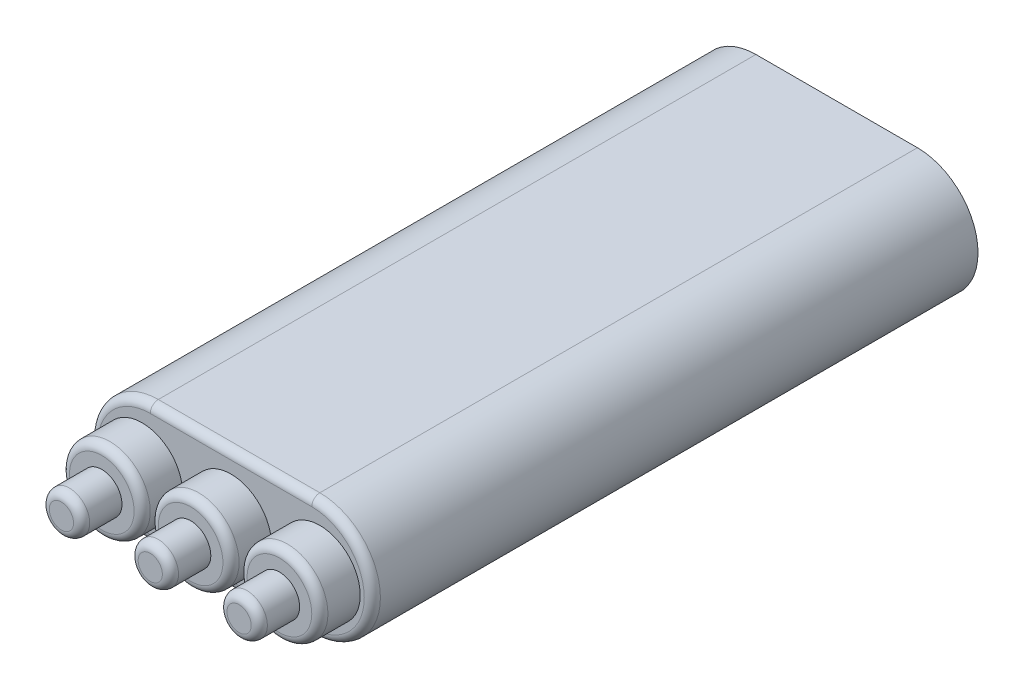
ISO-10303-21;
HEADER;
FILE_DESCRIPTION(('STEP AP214'),'2;1');
FILE_NAME('part.step','',(''),(''),'','','');
FILE_SCHEMA(('AUTOMOTIVE_DESIGN { 1 0 10303 214 1 1 1 1 }'));
ENDSEC;
DATA;
#1=APPLICATION_CONTEXT('core data for automotive mechanical design processes');
#2=APPLICATION_PROTOCOL_DEFINITION('international standard','automotive_design',2000,#1);
#3=PRODUCT_CONTEXT('',#1,'mechanical');
#4=PRODUCT('Part','Part','',(#3));
#5=PRODUCT_RELATED_PRODUCT_CATEGORY('part','',(#4));
#6=PRODUCT_DEFINITION_FORMATION('','',#4);
#7=PRODUCT_DEFINITION_CONTEXT('part definition',#1,'design');
#8=PRODUCT_DEFINITION('design','',#6,#7);
#9=PRODUCT_DEFINITION_SHAPE('','',#8);
#10=(LENGTH_UNIT() NAMED_UNIT(*) SI_UNIT(.MILLI.,.METRE.));
#11=(NAMED_UNIT(*) PLANE_ANGLE_UNIT() SI_UNIT($,.RADIAN.));
#12=(NAMED_UNIT(*) SI_UNIT($,.STERADIAN.) SOLID_ANGLE_UNIT());
#13=UNCERTAINTY_MEASURE_WITH_UNIT(LENGTH_MEASURE(1.E-05),#10,'distance_accuracy_value','');
#14=(GEOMETRIC_REPRESENTATION_CONTEXT(3) GLOBAL_UNCERTAINTY_ASSIGNED_CONTEXT((#13)) GLOBAL_UNIT_ASSIGNED_CONTEXT((#10,
#11,#12)) REPRESENTATION_CONTEXT('',''));
#15=CARTESIAN_POINT('',(0.,0.,0.));
#16=DIRECTION('',(0.,0.,1.));
#17=DIRECTION('',(1.,0.,0.));
#18=AXIS2_PLACEMENT_3D('',#15,#16,#17);
#19=CARTESIAN_POINT('',(2.2,0.,17.));
#20=DIRECTION('',(0.,0.,-1.));
#21=DIRECTION('',(-1.,0.,0.));
#22=AXIS2_PLACEMENT_3D('',#19,#20,#21);
#23=CYLINDRICAL_SURFACE('',#22,0.5);
#24=CARTESIAN_POINT('',(2.2,0.,16.8));
#25=DIRECTION('',(0.,0.,1.));
#26=DIRECTION('',(1.,0.,0.));
#27=AXIS2_PLACEMENT_3D('',#24,#25,#26);
#28=CIRCLE('',#27,0.5);
#29=CARTESIAN_POINT('',(2.7,0.,16.8));
#30=VERTEX_POINT('',#29);
#31=EDGE_CURVE('E11',#30,#30,#28,.F.);
#32=ORIENTED_EDGE('',*,*,#31,.T.);
#33=EDGE_LOOP('',(#32));
#34=FACE_BOUND('',#33,.T.);
#35=CARTESIAN_POINT('',(2.2,0.,16.));
#36=DIRECTION('',(0.,0.,1.));
#37=DIRECTION('',(1.,0.,0.));
#38=AXIS2_PLACEMENT_3D('',#35,#36,#37);
#39=CIRCLE('',#38,0.5);
#40=CARTESIAN_POINT('',(2.7,0.,16.));
#41=VERTEX_POINT('',#40);
#42=EDGE_CURVE('E53',#41,#41,#39,.T.);
#43=ORIENTED_EDGE('',*,*,#42,.T.);
#44=EDGE_LOOP('',(#43));
#45=FACE_BOUND('',#44,.T.);
#46=ADVANCED_FACE('F42',(#34,#45),#23,.T.);
#47=CARTESIAN_POINT('',(2.2,0.,17.));
#48=DIRECTION('',(0.,0.,1.));
#49=DIRECTION('',(1.,0.,0.));
#50=AXIS2_PLACEMENT_3D('',#47,#48,#49);
#51=PLANE('',#50);
#52=CARTESIAN_POINT('',(2.2,0.,17.));
#53=DIRECTION('',(0.,0.,1.));
#54=DIRECTION('',(1.,0.,0.));
#55=AXIS2_PLACEMENT_3D('',#52,#53,#54);
#56=CIRCLE('',#55,0.3);
#57=CARTESIAN_POINT('',(2.5,0.,17.));
#58=VERTEX_POINT('',#57);
#59=EDGE_CURVE('E49',#58,#58,#56,.T.);
#60=ORIENTED_EDGE('',*,*,#59,.T.);
#61=EDGE_LOOP('',(#60));
#62=FACE_BOUND('',#61,.T.);
#63=ADVANCED_FACE('F63',(#62),#51,.T.);
#64=CARTESIAN_POINT('',(2.2,0.,16.));
#65=DIRECTION('',(0.,0.,1.));
#66=DIRECTION('',(1.,0.,0.));
#67=AXIS2_PLACEMENT_3D('',#64,#65,#66);
#68=PLANE('',#67);
#69=ORIENTED_EDGE('',*,*,#42,.F.);
#70=EDGE_LOOP('',(#69));
#71=FACE_BOUND('',#70,.T.);
#72=ADVANCED_FACE('F61',(#71),#68,.F.);
#73=CARTESIAN_POINT('',(2.2,0.,16.8));
#74=DIRECTION('',(0.,0.,1.));
#75=DIRECTION('',(1.,0.,0.));
#76=AXIS2_PLACEMENT_3D('',#73,#74,#75);
#77=TOROIDAL_SURFACE('',#76,0.3,0.2);
#78=ORIENTED_EDGE('',*,*,#31,.F.);
#79=EDGE_LOOP('',(#78));
#80=FACE_BOUND('',#79,.T.);
#81=ORIENTED_EDGE('',*,*,#59,.F.);
#82=EDGE_LOOP('',(#81));
#83=FACE_BOUND('',#82,.T.);
#84=ADVANCED_FACE('F44',(#80,#83),#77,.T.);
#85=CLOSED_SHELL('',(#46,#63,#72,#84));
#86=MANIFOLD_SOLID_BREP('B2',#85);
#87=CARTESIAN_POINT('',(-2.2,0.,17.));
#88=DIRECTION('',(0.,0.,-1.));
#89=DIRECTION('',(-1.,0.,0.));
#90=AXIS2_PLACEMENT_3D('',#87,#88,#89);
#91=CYLINDRICAL_SURFACE('',#90,0.5);
#92=CARTESIAN_POINT('',(-2.2,0.,16.8));
#93=DIRECTION('',(0.,0.,1.));
#94=DIRECTION('',(1.,0.,0.));
#95=AXIS2_PLACEMENT_3D('',#92,#93,#94);
#96=CIRCLE('',#95,0.5);
#97=CARTESIAN_POINT('',(-1.7,0.,16.8));
#98=VERTEX_POINT('',#97);
#99=EDGE_CURVE('E41',#98,#98,#96,.F.);
#100=ORIENTED_EDGE('',*,*,#99,.T.);
#101=EDGE_LOOP('',(#100));
#102=FACE_BOUND('',#101,.T.);
#103=CARTESIAN_POINT('',(-2.2,0.,16.));
#104=DIRECTION('',(0.,0.,1.));
#105=DIRECTION('',(1.,0.,0.));
#106=AXIS2_PLACEMENT_3D('',#103,#104,#105);
#107=CIRCLE('',#106,0.5);
#108=CARTESIAN_POINT('',(-1.7,0.,16.));
#109=VERTEX_POINT('',#108);
#110=EDGE_CURVE('E117',#109,#109,#107,.T.);
#111=ORIENTED_EDGE('',*,*,#110,.T.);
#112=EDGE_LOOP('',(#111));
#113=FACE_BOUND('',#112,.T.);
#114=ADVANCED_FACE('F106',(#102,#113),#91,.T.);
#115=CARTESIAN_POINT('',(-2.2,0.,17.));
#116=DIRECTION('',(0.,0.,1.));
#117=DIRECTION('',(1.,0.,0.));
#118=AXIS2_PLACEMENT_3D('',#115,#116,#117);
#119=PLANE('',#118);
#120=CARTESIAN_POINT('',(-2.2,0.,17.));
#121=DIRECTION('',(0.,0.,1.));
#122=DIRECTION('',(1.,0.,0.));
#123=AXIS2_PLACEMENT_3D('',#120,#121,#122);
#124=CIRCLE('',#123,0.3);
#125=CARTESIAN_POINT('',(-1.9,0.,17.));
#126=VERTEX_POINT('',#125);
#127=EDGE_CURVE('E113',#126,#126,#124,.T.);
#128=ORIENTED_EDGE('',*,*,#127,.T.);
#129=EDGE_LOOP('',(#128));
#130=FACE_BOUND('',#129,.T.);
#131=ADVANCED_FACE('F127',(#130),#119,.T.);
#132=CARTESIAN_POINT('',(-2.2,0.,16.));
#133=DIRECTION('',(0.,0.,1.));
#134=DIRECTION('',(1.,0.,0.));
#135=AXIS2_PLACEMENT_3D('',#132,#133,#134);
#136=PLANE('',#135);
#137=ORIENTED_EDGE('',*,*,#110,.F.);
#138=EDGE_LOOP('',(#137));
#139=FACE_BOUND('',#138,.T.);
#140=ADVANCED_FACE('F125',(#139),#136,.F.);
#141=CARTESIAN_POINT('',(-2.2,0.,16.8));
#142=DIRECTION('',(0.,0.,1.));
#143=DIRECTION('',(1.,0.,0.));
#144=AXIS2_PLACEMENT_3D('',#141,#142,#143);
#145=TOROIDAL_SURFACE('',#144,0.3,0.2);
#146=ORIENTED_EDGE('',*,*,#99,.F.);
#147=EDGE_LOOP('',(#146));
#148=FACE_BOUND('',#147,.T.);
#149=ORIENTED_EDGE('',*,*,#127,.F.);
#150=EDGE_LOOP('',(#149));
#151=FACE_BOUND('',#150,.T.);
#152=ADVANCED_FACE('F108',(#148,#151),#145,.T.);
#153=CLOSED_SHELL('',(#114,#131,#140,#152));
#154=MANIFOLD_SOLID_BREP('B6',#153);
#155=CARTESIAN_POINT('',(0.,0.,17.));
#156=DIRECTION('',(0.,0.,-1.));
#157=DIRECTION('',(-1.,0.,0.));
#158=AXIS2_PLACEMENT_3D('',#155,#156,#157);
#159=CYLINDRICAL_SURFACE('',#158,0.5);
#160=CARTESIAN_POINT('',(0.,0.,16.8));
#161=DIRECTION('',(0.,0.,1.));
#162=DIRECTION('',(1.,0.,0.));
#163=AXIS2_PLACEMENT_3D('',#160,#161,#162);
#164=CIRCLE('',#163,0.5);
#165=CARTESIAN_POINT('',(0.5,0.,16.8));
#166=VERTEX_POINT('',#165);
#167=EDGE_CURVE('E105',#166,#166,#164,.F.);
#168=ORIENTED_EDGE('',*,*,#167,.T.);
#169=EDGE_LOOP('',(#168));
#170=FACE_BOUND('',#169,.T.);
#171=CARTESIAN_POINT('',(0.,0.,16.));
#172=DIRECTION('',(0.,0.,1.));
#173=DIRECTION('',(1.,0.,0.));
#174=AXIS2_PLACEMENT_3D('',#171,#172,#173);
#175=CIRCLE('',#174,0.5);
#176=CARTESIAN_POINT('',(0.5,0.,16.));
#177=VERTEX_POINT('',#176);
#178=EDGE_CURVE('E181',#177,#177,#175,.T.);
#179=ORIENTED_EDGE('',*,*,#178,.T.);
#180=EDGE_LOOP('',(#179));
#181=FACE_BOUND('',#180,.T.);
#182=ADVANCED_FACE('F170',(#170,#181),#159,.T.);
#183=CARTESIAN_POINT('',(0.,0.,17.));
#184=DIRECTION('',(0.,0.,1.));
#185=DIRECTION('',(1.,0.,0.));
#186=AXIS2_PLACEMENT_3D('',#183,#184,#185);
#187=PLANE('',#186);
#188=CARTESIAN_POINT('',(0.,0.,17.));
#189=DIRECTION('',(0.,0.,1.));
#190=DIRECTION('',(1.,0.,0.));
#191=AXIS2_PLACEMENT_3D('',#188,#189,#190);
#192=CIRCLE('',#191,0.3);
#193=CARTESIAN_POINT('',(0.3,0.,17.));
#194=VERTEX_POINT('',#193);
#195=EDGE_CURVE('E177',#194,#194,#192,.T.);
#196=ORIENTED_EDGE('',*,*,#195,.T.);
#197=EDGE_LOOP('',(#196));
#198=FACE_BOUND('',#197,.T.);
#199=ADVANCED_FACE('F191',(#198),#187,.T.);
#200=CARTESIAN_POINT('',(0.,0.,16.));
#201=DIRECTION('',(0.,0.,1.));
#202=DIRECTION('',(1.,0.,0.));
#203=AXIS2_PLACEMENT_3D('',#200,#201,#202);
#204=PLANE('',#203);
#205=ORIENTED_EDGE('',*,*,#178,.F.);
#206=EDGE_LOOP('',(#205));
#207=FACE_BOUND('',#206,.T.);
#208=ADVANCED_FACE('F189',(#207),#204,.F.);
#209=CARTESIAN_POINT('',(0.,0.,16.8));
#210=DIRECTION('',(0.,0.,1.));
#211=DIRECTION('',(1.,0.,0.));
#212=AXIS2_PLACEMENT_3D('',#209,#210,#211);
#213=TOROIDAL_SURFACE('',#212,0.3,0.2);
#214=ORIENTED_EDGE('',*,*,#167,.F.);
#215=EDGE_LOOP('',(#214));
#216=FACE_BOUND('',#215,.T.);
#217=ORIENTED_EDGE('',*,*,#195,.F.);
#218=EDGE_LOOP('',(#217));
#219=FACE_BOUND('',#218,.T.);
#220=ADVANCED_FACE('F172',(#216,#219),#213,.T.);
#221=CLOSED_SHELL('',(#182,#199,#208,#220));
#222=MANIFOLD_SOLID_BREP('B36',#221);
#223=CARTESIAN_POINT('',(2.2,0.,16.));
#224=DIRECTION('',(0.,0.,-1.));
#225=DIRECTION('',(-1.,0.,0.));
#226=AXIS2_PLACEMENT_3D('',#223,#224,#225);
#227=CYLINDRICAL_SURFACE('',#226,1.);
#228=CARTESIAN_POINT('',(2.2,0.,15.8));
#229=DIRECTION('',(0.,0.,1.));
#230=DIRECTION('',(1.,0.,0.));
#231=AXIS2_PLACEMENT_3D('',#228,#229,#230);
#232=CIRCLE('',#231,1.);
#233=CARTESIAN_POINT('',(3.2,0.,15.8));
#234=VERTEX_POINT('',#233);
#235=EDGE_CURVE('E169',#234,#234,#232,.F.);
#236=ORIENTED_EDGE('',*,*,#235,.T.);
#237=EDGE_LOOP('',(#236));
#238=FACE_BOUND('',#237,.T.);
#239=CARTESIAN_POINT('',(2.2,0.,15.));
#240=DIRECTION('',(0.,0.,1.));
#241=DIRECTION('',(1.,0.,0.));
#242=AXIS2_PLACEMENT_3D('',#239,#240,#241);
#243=CIRCLE('',#242,1.);
#244=CARTESIAN_POINT('',(3.2,0.,15.));
#245=VERTEX_POINT('',#244);
#246=EDGE_CURVE('E245',#245,#245,#243,.T.);
#247=ORIENTED_EDGE('',*,*,#246,.T.);
#248=EDGE_LOOP('',(#247));
#249=FACE_BOUND('',#248,.T.);
#250=ADVANCED_FACE('F234',(#238,#249),#227,.T.);
#251=CARTESIAN_POINT('',(2.2,0.,16.));
#252=DIRECTION('',(0.,0.,1.));
#253=DIRECTION('',(1.,0.,0.));
#254=AXIS2_PLACEMENT_3D('',#251,#252,#253);
#255=PLANE('',#254);
#256=CARTESIAN_POINT('',(2.2,0.,16.));
#257=DIRECTION('',(0.,0.,1.));
#258=DIRECTION('',(1.,0.,0.));
#259=AXIS2_PLACEMENT_3D('',#256,#257,#258);
#260=CIRCLE('',#259,0.8);
#261=CARTESIAN_POINT('',(3.,0.,16.));
#262=VERTEX_POINT('',#261);
#263=EDGE_CURVE('E241',#262,#262,#260,.T.);
#264=ORIENTED_EDGE('',*,*,#263,.T.);
#265=EDGE_LOOP('',(#264));
#266=FACE_BOUND('',#265,.T.);
#267=ADVANCED_FACE('F255',(#266),#255,.T.);
#268=CARTESIAN_POINT('',(2.2,0.,15.));
#269=DIRECTION('',(0.,0.,1.));
#270=DIRECTION('',(1.,0.,0.));
#271=AXIS2_PLACEMENT_3D('',#268,#269,#270);
#272=PLANE('',#271);
#273=ORIENTED_EDGE('',*,*,#246,.F.);
#274=EDGE_LOOP('',(#273));
#275=FACE_BOUND('',#274,.T.);
#276=ADVANCED_FACE('F253',(#275),#272,.F.);
#277=CARTESIAN_POINT('',(2.2,0.,15.8));
#278=DIRECTION('',(0.,0.,1.));
#279=DIRECTION('',(1.,0.,0.));
#280=AXIS2_PLACEMENT_3D('',#277,#278,#279);
#281=TOROIDAL_SURFACE('',#280,0.8,0.2);
#282=ORIENTED_EDGE('',*,*,#235,.F.);
#283=EDGE_LOOP('',(#282));
#284=FACE_BOUND('',#283,.T.);
#285=ORIENTED_EDGE('',*,*,#263,.F.);
#286=EDGE_LOOP('',(#285));
#287=FACE_BOUND('',#286,.T.);
#288=ADVANCED_FACE('F236',(#284,#287),#281,.T.);
#289=CLOSED_SHELL('',(#250,#267,#276,#288));
#290=MANIFOLD_SOLID_BREP('B100',#289);
#291=CARTESIAN_POINT('',(0.,0.,16.));
#292=DIRECTION('',(0.,0.,-1.));
#293=DIRECTION('',(-1.,0.,0.));
#294=AXIS2_PLACEMENT_3D('',#291,#292,#293);
#295=CYLINDRICAL_SURFACE('',#294,1.);
#296=CARTESIAN_POINT('',(0.,0.,15.8));
#297=DIRECTION('',(0.,0.,1.));
#298=DIRECTION('',(1.,0.,0.));
#299=AXIS2_PLACEMENT_3D('',#296,#297,#298);
#300=CIRCLE('',#299,1.);
#301=CARTESIAN_POINT('',(1.,0.,15.8));
#302=VERTEX_POINT('',#301);
#303=EDGE_CURVE('E233',#302,#302,#300,.F.);
#304=ORIENTED_EDGE('',*,*,#303,.T.);
#305=EDGE_LOOP('',(#304));
#306=FACE_BOUND('',#305,.T.);
#307=CARTESIAN_POINT('',(0.,0.,15.));
#308=DIRECTION('',(0.,0.,1.));
#309=DIRECTION('',(1.,0.,0.));
#310=AXIS2_PLACEMENT_3D('',#307,#308,#309);
#311=CIRCLE('',#310,1.);
#312=CARTESIAN_POINT('',(1.,0.,15.));
#313=VERTEX_POINT('',#312);
#314=EDGE_CURVE('E309',#313,#313,#311,.T.);
#315=ORIENTED_EDGE('',*,*,#314,.T.);
#316=EDGE_LOOP('',(#315));
#317=FACE_BOUND('',#316,.T.);
#318=ADVANCED_FACE('F298',(#306,#317),#295,.T.);
#319=CARTESIAN_POINT('',(0.,0.,16.));
#320=DIRECTION('',(0.,0.,1.));
#321=DIRECTION('',(1.,0.,0.));
#322=AXIS2_PLACEMENT_3D('',#319,#320,#321);
#323=PLANE('',#322);
#324=CARTESIAN_POINT('',(0.,0.,16.));
#325=DIRECTION('',(0.,0.,1.));
#326=DIRECTION('',(1.,0.,0.));
#327=AXIS2_PLACEMENT_3D('',#324,#325,#326);
#328=CIRCLE('',#327,0.8);
#329=CARTESIAN_POINT('',(0.8,0.,16.));
#330=VERTEX_POINT('',#329);
#331=EDGE_CURVE('E305',#330,#330,#328,.T.);
#332=ORIENTED_EDGE('',*,*,#331,.T.);
#333=EDGE_LOOP('',(#332));
#334=FACE_BOUND('',#333,.T.);
#335=ADVANCED_FACE('F319',(#334),#323,.T.);
#336=CARTESIAN_POINT('',(0.,0.,15.));
#337=DIRECTION('',(0.,0.,1.));
#338=DIRECTION('',(1.,0.,0.));
#339=AXIS2_PLACEMENT_3D('',#336,#337,#338);
#340=PLANE('',#339);
#341=ORIENTED_EDGE('',*,*,#314,.F.);
#342=EDGE_LOOP('',(#341));
#343=FACE_BOUND('',#342,.T.);
#344=ADVANCED_FACE('F317',(#343),#340,.F.);
#345=CARTESIAN_POINT('',(0.,0.,15.8));
#346=DIRECTION('',(0.,0.,1.));
#347=DIRECTION('',(1.,0.,0.));
#348=AXIS2_PLACEMENT_3D('',#345,#346,#347);
#349=TOROIDAL_SURFACE('',#348,0.8,0.2);
#350=ORIENTED_EDGE('',*,*,#303,.F.);
#351=EDGE_LOOP('',(#350));
#352=FACE_BOUND('',#351,.T.);
#353=ORIENTED_EDGE('',*,*,#331,.F.);
#354=EDGE_LOOP('',(#353));
#355=FACE_BOUND('',#354,.T.);
#356=ADVANCED_FACE('F300',(#352,#355),#349,.T.);
#357=CLOSED_SHELL('',(#318,#335,#344,#356));
#358=MANIFOLD_SOLID_BREP('B164',#357);
#359=CARTESIAN_POINT('',(-2.2,0.,16.));
#360=DIRECTION('',(0.,0.,-1.));
#361=DIRECTION('',(-1.,0.,0.));
#362=AXIS2_PLACEMENT_3D('',#359,#360,#361);
#363=CYLINDRICAL_SURFACE('',#362,1.);
#364=CARTESIAN_POINT('',(-2.2,0.,15.8));
#365=DIRECTION('',(0.,0.,1.));
#366=DIRECTION('',(1.,0.,0.));
#367=AXIS2_PLACEMENT_3D('',#364,#365,#366);
#368=CIRCLE('',#367,1.);
#369=CARTESIAN_POINT('',(-1.2,0.,15.8));
#370=VERTEX_POINT('',#369);
#371=EDGE_CURVE('E297',#370,#370,#368,.F.);
#372=ORIENTED_EDGE('',*,*,#371,.T.);
#373=EDGE_LOOP('',(#372));
#374=FACE_BOUND('',#373,.T.);
#375=CARTESIAN_POINT('',(-2.2,0.,15.));
#376=DIRECTION('',(0.,0.,1.));
#377=DIRECTION('',(1.,0.,0.));
#378=AXIS2_PLACEMENT_3D('',#375,#376,#377);
#379=CIRCLE('',#378,1.);
#380=CARTESIAN_POINT('',(-1.2,0.,15.));
#381=VERTEX_POINT('',#380);
#382=EDGE_CURVE('E374',#381,#381,#379,.T.);
#383=ORIENTED_EDGE('',*,*,#382,.T.);
#384=EDGE_LOOP('',(#383));
#385=FACE_BOUND('',#384,.T.);
#386=ADVANCED_FACE('F363',(#374,#385),#363,.T.);
#387=CARTESIAN_POINT('',(-2.2,0.,16.));
#388=DIRECTION('',(0.,0.,1.));
#389=DIRECTION('',(1.,0.,0.));
#390=AXIS2_PLACEMENT_3D('',#387,#388,#389);
#391=PLANE('',#390);
#392=CARTESIAN_POINT('',(-2.2,0.,16.));
#393=DIRECTION('',(0.,0.,1.));
#394=DIRECTION('',(1.,0.,0.));
#395=AXIS2_PLACEMENT_3D('',#392,#393,#394);
#396=CIRCLE('',#395,0.8);
#397=CARTESIAN_POINT('',(-1.4,0.,16.));
#398=VERTEX_POINT('',#397);
#399=EDGE_CURVE('E370',#398,#398,#396,.T.);
#400=ORIENTED_EDGE('',*,*,#399,.T.);
#401=EDGE_LOOP('',(#400));
#402=FACE_BOUND('',#401,.T.);
#403=ADVANCED_FACE('F384',(#402),#391,.T.);
#404=CARTESIAN_POINT('',(-2.2,0.,15.));
#405=DIRECTION('',(0.,0.,1.));
#406=DIRECTION('',(1.,0.,0.));
#407=AXIS2_PLACEMENT_3D('',#404,#405,#406);
#408=PLANE('',#407);
#409=ORIENTED_EDGE('',*,*,#382,.F.);
#410=EDGE_LOOP('',(#409));
#411=FACE_BOUND('',#410,.T.);
#412=ADVANCED_FACE('F382',(#411),#408,.F.);
#413=CARTESIAN_POINT('',(-2.2,0.,15.8));
#414=DIRECTION('',(0.,0.,1.));
#415=DIRECTION('',(1.,0.,0.));
#416=AXIS2_PLACEMENT_3D('',#413,#414,#415);
#417=TOROIDAL_SURFACE('',#416,0.8,0.2);
#418=ORIENTED_EDGE('',*,*,#371,.F.);
#419=EDGE_LOOP('',(#418));
#420=FACE_BOUND('',#419,.T.);
#421=ORIENTED_EDGE('',*,*,#399,.F.);
#422=EDGE_LOOP('',(#421));
#423=FACE_BOUND('',#422,.T.);
#424=ADVANCED_FACE('F365',(#420,#423),#417,.T.);
#425=CLOSED_SHELL('',(#386,#403,#412,#424));
#426=MANIFOLD_SOLID_BREP('B228',#425);
#427=CARTESIAN_POINT('',(-2.,0.,15.));
#428=DIRECTION('',(0.,0.,-1.));
#429=DIRECTION('',(-1.,0.,0.));
#430=AXIS2_PLACEMENT_3D('',#427,#428,#429);
#431=CYLINDRICAL_SURFACE('',#430,1.5);
#432=DIRECTION('',(0.,0.,-1.));
#433=VECTOR('',#432,1.);
#434=CARTESIAN_POINT('',(-2.,-1.5,15.));
#435=LINE('',#434,#433);
#436=CARTESIAN_POINT('',(-2.,-1.5,14.8));
#437=VERTEX_POINT('',#436);
#438=CARTESIAN_POINT('',(-2.,-1.5,0.));
#439=VERTEX_POINT('',#438);
#440=EDGE_CURVE('E471',#437,#439,#435,.T.);
#441=ORIENTED_EDGE('',*,*,#440,.F.);
#442=CARTESIAN_POINT('',(-2.,0.,14.8));
#443=DIRECTION('',(0.,0.,1.));
#444=DIRECTION('',(1.,0.,0.));
#445=AXIS2_PLACEMENT_3D('',#442,#443,#444);
#446=CIRCLE('',#445,1.5);
#447=CARTESIAN_POINT('',(-2.,1.5,14.8));
#448=VERTEX_POINT('',#447);
#449=EDGE_CURVE('E361',#437,#448,#446,.F.);
#450=ORIENTED_EDGE('',*,*,#449,.T.);
#451=DIRECTION('',(0.,0.,-1.));
#452=VECTOR('',#451,1.);
#453=CARTESIAN_POINT('',(-2.,1.5,15.));
#454=LINE('',#453,#452);
#455=CARTESIAN_POINT('',(-2.,1.5,0.));
#456=VERTEX_POINT('',#455);
#457=EDGE_CURVE('E491',#448,#456,#454,.T.);
#458=ORIENTED_EDGE('',*,*,#457,.T.);
#459=CARTESIAN_POINT('',(-2.,0.,0.));
#460=DIRECTION('',(0.,0.,1.));
#461=DIRECTION('',(1.,0.,0.));
#462=AXIS2_PLACEMENT_3D('',#459,#460,#461);
#463=CIRCLE('',#462,1.5);
#464=EDGE_CURVE('E486',#456,#439,#463,.T.);
#465=ORIENTED_EDGE('',*,*,#464,.T.);
#466=EDGE_LOOP('',(#441,#450,#458,#465));
#467=FACE_BOUND('',#466,.T.);
#468=ADVANCED_FACE('F419',(#467),#431,.T.);
#469=CARTESIAN_POINT('',(-2.,-1.5,15.));
#470=DIRECTION('',(0.,1.,0.));
#471=DIRECTION('',(-1.,0.,0.));
#472=AXIS2_PLACEMENT_3D('',#469,#470,#471);
#473=PLANE('',#472);
#474=DIRECTION('',(0.,0.,-1.));
#475=VECTOR('',#474,1.);
#476=CARTESIAN_POINT('',(2.,-1.5,15.));
#477=LINE('',#476,#475);
#478=CARTESIAN_POINT('',(2.,-1.5,14.8));
#479=VERTEX_POINT('',#478);
#480=CARTESIAN_POINT('',(2.,-1.5,0.));
#481=VERTEX_POINT('',#480);
#482=EDGE_CURVE('E480',#479,#481,#477,.T.);
#483=ORIENTED_EDGE('',*,*,#482,.F.);
#484=DIRECTION('',(1.,0.,0.));
#485=VECTOR('',#484,1.);
#486=CARTESIAN_POINT('',(-2.,-1.5,14.8));
#487=LINE('',#486,#485);
#488=EDGE_CURVE('E428',#479,#437,#487,.F.);
#489=ORIENTED_EDGE('',*,*,#488,.T.);
#490=ORIENTED_EDGE('',*,*,#440,.T.);
#491=DIRECTION('',(1.,0.,0.));
#492=VECTOR('',#491,1.);
#493=CARTESIAN_POINT('',(-2.,-1.5,0.));
#494=LINE('',#493,#492);
#495=EDGE_CURVE('E474',#439,#481,#494,.T.);
#496=ORIENTED_EDGE('',*,*,#495,.T.);
#497=EDGE_LOOP('',(#483,#489,#490,#496));
#498=FACE_BOUND('',#497,.T.);
#499=ADVANCED_FACE('F473',(#498),#473,.F.);
#500=CARTESIAN_POINT('',(2.,0.,15.));
#501=DIRECTION('',(0.,0.,-1.));
#502=DIRECTION('',(-1.,0.,0.));
#503=AXIS2_PLACEMENT_3D('',#500,#501,#502);
#504=CYLINDRICAL_SURFACE('',#503,1.5);
#505=DIRECTION('',(0.,0.,-1.));
#506=VECTOR('',#505,1.);
#507=CARTESIAN_POINT('',(2.,1.5,15.));
#508=LINE('',#507,#506);
#509=CARTESIAN_POINT('',(2.,1.5,14.8));
#510=VERTEX_POINT('',#509);
#511=CARTESIAN_POINT('',(2.,1.5,0.));
#512=VERTEX_POINT('',#511);
#513=EDGE_CURVE('E501',#510,#512,#508,.T.);
#514=ORIENTED_EDGE('',*,*,#513,.F.);
#515=CARTESIAN_POINT('',(2.,0.,14.8));
#516=DIRECTION('',(0.,0.,1.));
#517=DIRECTION('',(1.,0.,0.));
#518=AXIS2_PLACEMENT_3D('',#515,#516,#517);
#519=CIRCLE('',#518,1.5);
#520=EDGE_CURVE('E443',#510,#479,#519,.F.);
#521=ORIENTED_EDGE('',*,*,#520,.T.);
#522=ORIENTED_EDGE('',*,*,#482,.T.);
#523=CARTESIAN_POINT('',(2.,0.,0.));
#524=DIRECTION('',(0.,0.,1.));
#525=DIRECTION('',(1.,0.,0.));
#526=AXIS2_PLACEMENT_3D('',#523,#524,#525);
#527=CIRCLE('',#526,1.5);
#528=EDGE_CURVE('E488',#481,#512,#527,.T.);
#529=ORIENTED_EDGE('',*,*,#528,.T.);
#530=EDGE_LOOP('',(#514,#521,#522,#529));
#531=FACE_BOUND('',#530,.T.);
#532=ADVANCED_FACE('F539',(#531),#504,.T.);
#533=CARTESIAN_POINT('',(-2.,1.5,15.));
#534=DIRECTION('',(0.,-1.,0.));
#535=DIRECTION('',(1.,0.,0.));
#536=AXIS2_PLACEMENT_3D('',#533,#534,#535);
#537=PLANE('',#536);
#538=ORIENTED_EDGE('',*,*,#457,.F.);
#539=DIRECTION('',(-1.,0.,0.));
#540=VECTOR('',#539,1.);
#541=CARTESIAN_POINT('',(2.,1.5,14.8));
#542=LINE('',#541,#540);
#543=EDGE_CURVE('E512',#448,#510,#542,.F.);
#544=ORIENTED_EDGE('',*,*,#543,.T.);
#545=ORIENTED_EDGE('',*,*,#513,.T.);
#546=DIRECTION('',(-1.,0.,0.));
#547=VECTOR('',#546,1.);
#548=CARTESIAN_POINT('',(-2.,1.5,0.));
#549=LINE('',#548,#547);
#550=EDGE_CURVE('E498',#512,#456,#549,.T.);
#551=ORIENTED_EDGE('',*,*,#550,.T.);
#552=EDGE_LOOP('',(#538,#544,#545,#551));
#553=FACE_BOUND('',#552,.T.);
#554=ADVANCED_FACE('F538',(#553),#537,.F.);
#555=CARTESIAN_POINT('',(-2.,0.,15.));
#556=DIRECTION('',(0.,0.,1.));
#557=DIRECTION('',(1.,0.,0.));
#558=AXIS2_PLACEMENT_3D('',#555,#556,#557);
#559=PLANE('',#558);
#560=CARTESIAN_POINT('',(2.,0.,15.));
#561=DIRECTION('',(0.,0.,1.));
#562=DIRECTION('',(1.,0.,0.));
#563=AXIS2_PLACEMENT_3D('',#560,#561,#562);
#564=CIRCLE('',#563,1.3);
#565=CARTESIAN_POINT('',(2.,-1.3,15.));
#566=VERTEX_POINT('',#565);
#567=CARTESIAN_POINT('',(2.,1.3,15.));
#568=VERTEX_POINT('',#567);
#569=EDGE_CURVE('E507',#566,#568,#564,.T.);
#570=ORIENTED_EDGE('',*,*,#569,.T.);
#571=DIRECTION('',(-1.,0.,0.));
#572=VECTOR('',#571,1.);
#573=CARTESIAN_POINT('',(-2.,1.3,15.));
#574=LINE('',#573,#572);
#575=CARTESIAN_POINT('',(-2.,1.3,15.));
#576=VERTEX_POINT('',#575);
#577=EDGE_CURVE('E509',#568,#576,#574,.T.);
#578=ORIENTED_EDGE('',*,*,#577,.T.);
#579=CARTESIAN_POINT('',(-2.,0.,15.));
#580=DIRECTION('',(0.,0.,1.));
#581=DIRECTION('',(1.,0.,0.));
#582=AXIS2_PLACEMENT_3D('',#579,#580,#581);
#583=CIRCLE('',#582,1.3);
#584=CARTESIAN_POINT('',(-2.,-1.3,15.));
#585=VERTEX_POINT('',#584);
#586=EDGE_CURVE('E479',#576,#585,#583,.T.);
#587=ORIENTED_EDGE('',*,*,#586,.T.);
#588=DIRECTION('',(1.,0.,0.));
#589=VECTOR('',#588,1.);
#590=CARTESIAN_POINT('',(2.,-1.3,15.));
#591=LINE('',#590,#589);
#592=EDGE_CURVE('E505',#585,#566,#591,.T.);
#593=ORIENTED_EDGE('',*,*,#592,.T.);
#594=EDGE_LOOP('',(#570,#578,#587,#593));
#595=FACE_BOUND('',#594,.T.);
#596=ADVANCED_FACE('F531',(#595),#559,.T.);
#597=CARTESIAN_POINT('',(-2.,0.,0.));
#598=DIRECTION('',(0.,0.,1.));
#599=DIRECTION('',(1.,0.,0.));
#600=AXIS2_PLACEMENT_3D('',#597,#598,#599);
#601=PLANE('',#600);
#602=ORIENTED_EDGE('',*,*,#464,.F.);
#603=ORIENTED_EDGE('',*,*,#550,.F.);
#604=ORIENTED_EDGE('',*,*,#528,.F.);
#605=ORIENTED_EDGE('',*,*,#495,.F.);
#606=EDGE_LOOP('',(#602,#603,#604,#605));
#607=FACE_BOUND('',#606,.T.);
#608=ADVANCED_FACE('F484',(#607),#601,.F.);
#609=CARTESIAN_POINT('',(-2.,-1.3,14.8));
#610=DIRECTION('',(-1.,0.,0.));
#611=DIRECTION('',(0.,-1.,0.));
#612=AXIS2_PLACEMENT_3D('',#609,#610,#611);
#613=CYLINDRICAL_SURFACE('',#612,0.2);
#614=CARTESIAN_POINT('',(-2.,-1.3,14.8));
#615=DIRECTION('',(-1.,0.,0.));
#616=DIRECTION('',(0.,0.,1.));
#617=AXIS2_PLACEMENT_3D('',#614,#615,#616);
#618=CIRCLE('',#617,0.2);
#619=EDGE_CURVE('E495',#437,#585,#618,.T.);
#620=ORIENTED_EDGE('',*,*,#619,.F.);
#621=ORIENTED_EDGE('',*,*,#488,.F.);
#622=CARTESIAN_POINT('',(2.,-1.3,14.8));
#623=DIRECTION('',(1.,0.,0.));
#624=DIRECTION('',(0.,0.,-1.));
#625=AXIS2_PLACEMENT_3D('',#622,#623,#624);
#626=CIRCLE('',#625,0.2);
#627=EDGE_CURVE('E423',#566,#479,#626,.T.);
#628=ORIENTED_EDGE('',*,*,#627,.F.);
#629=ORIENTED_EDGE('',*,*,#592,.F.);
#630=EDGE_LOOP('',(#620,#621,#628,#629));
#631=FACE_BOUND('',#630,.T.);
#632=ADVANCED_FACE('F421',(#631),#613,.T.);
#633=CARTESIAN_POINT('',(2.,0.,14.8));
#634=DIRECTION('',(0.,0.,1.));
#635=DIRECTION('',(1.,0.,0.));
#636=AXIS2_PLACEMENT_3D('',#633,#634,#635);
#637=TOROIDAL_SURFACE('',#636,1.3,0.2);
#638=ORIENTED_EDGE('',*,*,#627,.T.);
#639=ORIENTED_EDGE('',*,*,#520,.F.);
#640=CARTESIAN_POINT('',(2.,1.3,14.8));
#641=DIRECTION('',(-1.,0.,0.));
#642=DIRECTION('',(0.,0.,1.));
#643=AXIS2_PLACEMENT_3D('',#640,#641,#642);
#644=CIRCLE('',#643,0.2);
#645=EDGE_CURVE('E519',#568,#510,#644,.T.);
#646=ORIENTED_EDGE('',*,*,#645,.F.);
#647=ORIENTED_EDGE('',*,*,#569,.F.);
#648=EDGE_LOOP('',(#638,#639,#646,#647));
#649=FACE_BOUND('',#648,.T.);
#650=ADVANCED_FACE('F556',(#649),#637,.T.);
#651=CARTESIAN_POINT('',(-2.,0.,14.8));
#652=DIRECTION('',(0.,0.,1.));
#653=DIRECTION('',(1.,0.,0.));
#654=AXIS2_PLACEMENT_3D('',#651,#652,#653);
#655=TOROIDAL_SURFACE('',#654,1.3,0.2);
#656=ORIENTED_EDGE('',*,*,#619,.T.);
#657=ORIENTED_EDGE('',*,*,#586,.F.);
#658=CARTESIAN_POINT('',(-2.,1.3,14.8));
#659=DIRECTION('',(1.,0.,0.));
#660=DIRECTION('',(0.,0.,-1.));
#661=AXIS2_PLACEMENT_3D('',#658,#659,#660);
#662=CIRCLE('',#661,0.2);
#663=EDGE_CURVE('E517',#448,#576,#662,.T.);
#664=ORIENTED_EDGE('',*,*,#663,.F.);
#665=ORIENTED_EDGE('',*,*,#449,.F.);
#666=EDGE_LOOP('',(#656,#657,#664,#665));
#667=FACE_BOUND('',#666,.T.);
#668=ADVANCED_FACE('F524',(#667),#655,.T.);
#669=CARTESIAN_POINT('',(-2.,1.3,14.8));
#670=DIRECTION('',(1.,0.,0.));
#671=DIRECTION('',(0.,1.,0.));
#672=AXIS2_PLACEMENT_3D('',#669,#670,#671);
#673=CYLINDRICAL_SURFACE('',#672,0.2);
#674=ORIENTED_EDGE('',*,*,#645,.T.);
#675=ORIENTED_EDGE('',*,*,#543,.F.);
#676=ORIENTED_EDGE('',*,*,#663,.T.);
#677=ORIENTED_EDGE('',*,*,#577,.F.);
#678=EDGE_LOOP('',(#674,#675,#676,#677));
#679=FACE_BOUND('',#678,.T.);
#680=ADVANCED_FACE('F535',(#679),#673,.T.);
#681=CLOSED_SHELL('',(#468,#499,#532,#554,#596,#608,#632,#650,#668,#680));
#682=MANIFOLD_SOLID_BREP('B292',#681);
#683=ADVANCED_BREP_SHAPE_REPRESENTATION('',(#18,#86,#154,#222,#290,#358,#426,#682),#14);
#684=SHAPE_DEFINITION_REPRESENTATION(#9,#683);
ENDSEC;
END-ISO-10303-21;
